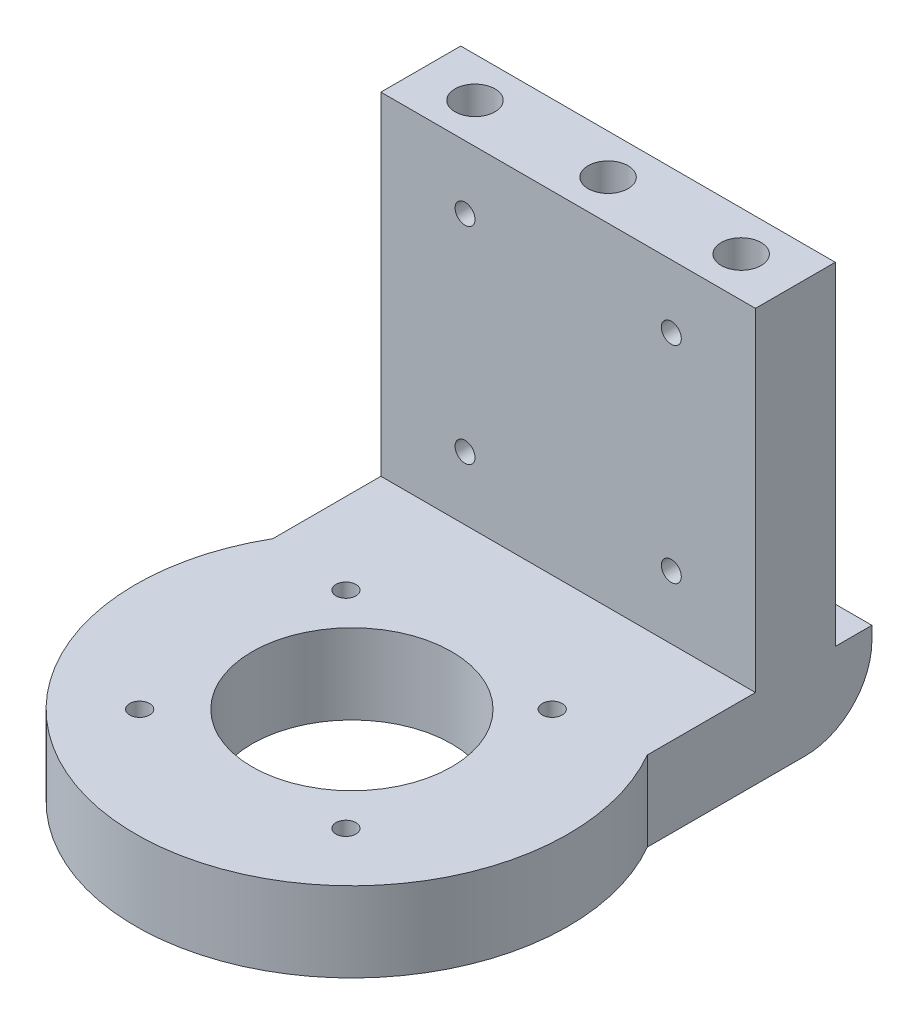
ISO-10303-21;
HEADER;
FILE_DESCRIPTION(('STEP AP214'),'2;1');
FILE_NAME('part.step','',(''),(''),'','','');
FILE_SCHEMA(('AUTOMOTIVE_DESIGN { 1 0 10303 214 1 1 1 1 }'));
ENDSEC;
DATA;
#1=APPLICATION_CONTEXT('core data for automotive mechanical design processes');
#2=APPLICATION_PROTOCOL_DEFINITION('international standard','automotive_design',2000,#1);
#3=PRODUCT_CONTEXT('',#1,'mechanical');
#4=PRODUCT('Part','Part','',(#3));
#5=PRODUCT_RELATED_PRODUCT_CATEGORY('part','',(#4));
#6=PRODUCT_DEFINITION_FORMATION('','',#4);
#7=PRODUCT_DEFINITION_CONTEXT('part definition',#1,'design');
#8=PRODUCT_DEFINITION('design','',#6,#7);
#9=PRODUCT_DEFINITION_SHAPE('','',#8);
#10=(LENGTH_UNIT() NAMED_UNIT(*) SI_UNIT(.MILLI.,.METRE.));
#11=(NAMED_UNIT(*) PLANE_ANGLE_UNIT() SI_UNIT($,.RADIAN.));
#12=(NAMED_UNIT(*) SI_UNIT($,.STERADIAN.) SOLID_ANGLE_UNIT());
#13=UNCERTAINTY_MEASURE_WITH_UNIT(LENGTH_MEASURE(1.E-05),#10,'distance_accuracy_value','');
#14=(GEOMETRIC_REPRESENTATION_CONTEXT(3) GLOBAL_UNCERTAINTY_ASSIGNED_CONTEXT((#13)) GLOBAL_UNIT_ASSIGNED_CONTEXT((#10,
#11,#12)) REPRESENTATION_CONTEXT('',''));
#15=CARTESIAN_POINT('',(0.,0.,0.));
#16=DIRECTION('',(0.,0.,1.));
#17=DIRECTION('',(1.,0.,0.));
#18=AXIS2_PLACEMENT_3D('',#15,#16,#17);
#19=CARTESIAN_POINT('',(-15.95,0.,-15.05));
#20=DIRECTION('',(0.,1.,0.));
#21=DIRECTION('',(0.,0.,1.));
#22=AXIS2_PLACEMENT_3D('',#19,#20,#21);
#23=CYLINDRICAL_SURFACE('',#22,1.5);
#24=CARTESIAN_POINT('',(-15.95,12.,-15.05));
#25=DIRECTION('',(0.,1.,0.));
#26=DIRECTION('',(0.,0.,1.));
#27=AXIS2_PLACEMENT_3D('',#24,#25,#26);
#28=CIRCLE('',#27,1.5);
#29=CARTESIAN_POINT('',(-15.95,12.,-13.55));
#30=VERTEX_POINT('',#29);
#31=EDGE_CURVE('E182',#30,#30,#28,.T.);
#32=ORIENTED_EDGE('',*,*,#31,.T.);
#33=EDGE_LOOP('',(#32));
#34=FACE_BOUND('',#33,.T.);
#35=CARTESIAN_POINT('',(-15.95,3.,-15.05));
#36=DIRECTION('',(0.,-1.,0.));
#37=DIRECTION('',(0.,0.,-1.));
#38=AXIS2_PLACEMENT_3D('',#35,#36,#37);
#39=CIRCLE('',#38,1.5);
#40=CARTESIAN_POINT('',(-15.95,3.,-16.55));
#41=VERTEX_POINT('',#40);
#42=EDGE_CURVE('E223',#41,#41,#39,.F.);
#43=ORIENTED_EDGE('',*,*,#42,.F.);
#44=EDGE_LOOP('',(#43));
#45=FACE_BOUND('',#44,.T.);
#46=ADVANCED_FACE('F42',(#34,#45),#23,.F.);
#47=CARTESIAN_POINT('',(15.05,0.,-15.05));
#48=DIRECTION('',(0.,1.,0.));
#49=DIRECTION('',(0.,0.,1.));
#50=AXIS2_PLACEMENT_3D('',#47,#48,#49);
#51=CYLINDRICAL_SURFACE('',#50,1.5);
#52=CARTESIAN_POINT('',(15.05,12.,-15.05));
#53=DIRECTION('',(0.,1.,0.));
#54=DIRECTION('',(0.,0.,1.));
#55=AXIS2_PLACEMENT_3D('',#52,#53,#54);
#56=CIRCLE('',#55,1.5);
#57=CARTESIAN_POINT('',(15.05,12.,-13.55));
#58=VERTEX_POINT('',#57);
#59=EDGE_CURVE('E178',#58,#58,#56,.T.);
#60=ORIENTED_EDGE('',*,*,#59,.T.);
#61=EDGE_LOOP('',(#60));
#62=FACE_BOUND('',#61,.T.);
#63=CARTESIAN_POINT('',(15.05,3.,-15.05));
#64=DIRECTION('',(0.,-1.,0.));
#65=DIRECTION('',(0.,0.,-1.));
#66=AXIS2_PLACEMENT_3D('',#63,#64,#65);
#67=CIRCLE('',#66,1.5);
#68=CARTESIAN_POINT('',(15.05,3.,-16.55));
#69=VERTEX_POINT('',#68);
#70=EDGE_CURVE('E219',#69,#69,#67,.F.);
#71=ORIENTED_EDGE('',*,*,#70,.F.);
#72=EDGE_LOOP('',(#71));
#73=FACE_BOUND('',#72,.T.);
#74=ADVANCED_FACE('F287',(#62,#73),#51,.F.);
#75=CARTESIAN_POINT('',(15.05,0.,15.95));
#76=DIRECTION('',(0.,1.,0.));
#77=DIRECTION('',(0.,0.,1.));
#78=AXIS2_PLACEMENT_3D('',#75,#76,#77);
#79=CYLINDRICAL_SURFACE('',#78,1.5);
#80=CARTESIAN_POINT('',(15.05,12.,15.95));
#81=DIRECTION('',(0.,1.,0.));
#82=DIRECTION('',(0.,0.,1.));
#83=AXIS2_PLACEMENT_3D('',#80,#81,#82);
#84=CIRCLE('',#83,1.5);
#85=CARTESIAN_POINT('',(15.05,12.,17.45));
#86=VERTEX_POINT('',#85);
#87=EDGE_CURVE('E183',#86,#86,#84,.T.);
#88=ORIENTED_EDGE('',*,*,#87,.T.);
#89=EDGE_LOOP('',(#88));
#90=FACE_BOUND('',#89,.T.);
#91=CARTESIAN_POINT('',(15.05,3.,15.95));
#92=DIRECTION('',(0.,-1.,0.));
#93=DIRECTION('',(0.,0.,-1.));
#94=AXIS2_PLACEMENT_3D('',#91,#92,#93);
#95=CIRCLE('',#94,1.5);
#96=CARTESIAN_POINT('',(15.05,3.,14.45));
#97=VERTEX_POINT('',#96);
#98=EDGE_CURVE('E214',#97,#97,#95,.F.);
#99=ORIENTED_EDGE('',*,*,#98,.F.);
#100=EDGE_LOOP('',(#99));
#101=FACE_BOUND('',#100,.T.);
#102=ADVANCED_FACE('F293',(#90,#101),#79,.F.);
#103=CARTESIAN_POINT('',(-15.95,0.,15.95));
#104=DIRECTION('',(0.,1.,0.));
#105=DIRECTION('',(0.,0.,1.));
#106=AXIS2_PLACEMENT_3D('',#103,#104,#105);
#107=CYLINDRICAL_SURFACE('',#106,1.5);
#108=CARTESIAN_POINT('',(-15.95,12.,15.95));
#109=DIRECTION('',(0.,1.,0.));
#110=DIRECTION('',(0.,0.,1.));
#111=AXIS2_PLACEMENT_3D('',#108,#109,#110);
#112=CIRCLE('',#111,1.5);
#113=CARTESIAN_POINT('',(-15.95,12.,17.45));
#114=VERTEX_POINT('',#113);
#115=EDGE_CURVE('E168',#114,#114,#112,.T.);
#116=ORIENTED_EDGE('',*,*,#115,.T.);
#117=EDGE_LOOP('',(#116));
#118=FACE_BOUND('',#117,.T.);
#119=CARTESIAN_POINT('',(-15.95,3.,15.95));
#120=DIRECTION('',(0.,-1.,0.));
#121=DIRECTION('',(0.,0.,-1.));
#122=AXIS2_PLACEMENT_3D('',#119,#120,#121);
#123=CIRCLE('',#122,1.5);
#124=CARTESIAN_POINT('',(-15.95,3.,14.45));
#125=VERTEX_POINT('',#124);
#126=EDGE_CURVE('E210',#125,#125,#123,.F.);
#127=ORIENTED_EDGE('',*,*,#126,.F.);
#128=EDGE_LOOP('',(#127));
#129=FACE_BOUND('',#128,.T.);
#130=ADVANCED_FACE('F299',(#118,#129),#107,.F.);
#131=CARTESIAN_POINT('',(0.,12.,0.));
#132=DIRECTION('',(0.,1.,0.));
#133=DIRECTION('',(0.,0.,1.));
#134=AXIS2_PLACEMENT_3D('',#131,#132,#133);
#135=PLANE('',#134);
#136=DIRECTION('',(-1.,0.,0.));
#137=VECTOR('',#136,1.);
#138=CARTESIAN_POINT('',(28.1458256229942,12.,-44.5));
#139=LINE('',#138,#137);
#140=CARTESIAN_POINT('',(28.1458256229942,12.,-44.5));
#141=VERTEX_POINT('',#140);
#142=CARTESIAN_POINT('',(-28.1458256229944,12.,-44.5));
#143=VERTEX_POINT('',#142);
#144=EDGE_CURVE('E133',#141,#143,#139,.T.);
#145=ORIENTED_EDGE('',*,*,#144,.F.);
#146=DIRECTION('',(0.,0.,1.));
#147=VECTOR('',#146,1.);
#148=CARTESIAN_POINT('',(28.1458256229942,12.,0.));
#149=LINE('',#148,#147);
#150=CARTESIAN_POINT('',(28.1458256229942,12.,-50.));
#151=VERTEX_POINT('',#150);
#152=EDGE_CURVE('E154',#151,#141,#149,.T.);
#153=ORIENTED_EDGE('',*,*,#152,.F.);
#154=DIRECTION('',(-1.,0.,0.));
#155=VECTOR('',#154,1.);
#156=CARTESIAN_POINT('',(0.,12.,-50.));
#157=LINE('',#156,#155);
#158=CARTESIAN_POINT('',(-28.1458256229944,12.,-50.));
#159=VERTEX_POINT('',#158);
#160=EDGE_CURVE('E140',#151,#159,#157,.T.);
#161=ORIENTED_EDGE('',*,*,#160,.T.);
#162=DIRECTION('',(0.,0.,1.));
#163=VECTOR('',#162,1.);
#164=CARTESIAN_POINT('',(-28.1458256229944,12.,0.));
#165=LINE('',#164,#163);
#166=EDGE_CURVE('E158',#159,#143,#165,.T.);
#167=ORIENTED_EDGE('',*,*,#166,.T.);
#168=EDGE_LOOP('',(#145,#153,#161,#167));
#169=FACE_BOUND('',#168,.T.);
#170=ADVANCED_FACE('F272',(#169),#135,.T.);
#171=CARTESIAN_POINT('',(0.,12.,0.));
#172=DIRECTION('',(0.,-1.,0.));
#173=DIRECTION('',(0.,0.,-1.));
#174=AXIS2_PLACEMENT_3D('',#171,#172,#173);
#175=CYLINDRICAL_SURFACE('',#174,32.5);
#176=DIRECTION('',(0.,1.,0.));
#177=VECTOR('',#176,1.);
#178=CARTESIAN_POINT('',(28.1458256229942,0.,-16.2500000000001));
#179=LINE('',#178,#177);
#180=CARTESIAN_POINT('',(28.1458256229942,0.,-16.2500000000001));
#181=VERTEX_POINT('',#180);
#182=CARTESIAN_POINT('',(28.1458256229942,12.,-16.2500000000001));
#183=VERTEX_POINT('',#182);
#184=EDGE_CURVE('E169',#181,#183,#179,.T.);
#185=ORIENTED_EDGE('',*,*,#184,.T.);
#186=CARTESIAN_POINT('',(0.,12.,0.));
#187=DIRECTION('',(0.,1.,0.));
#188=DIRECTION('',(0.,0.,1.));
#189=AXIS2_PLACEMENT_3D('',#186,#187,#188);
#190=CIRCLE('',#189,32.5);
#191=CARTESIAN_POINT('',(-28.1458256229944,12.,-16.2499999999998));
#192=VERTEX_POINT('',#191);
#193=EDGE_CURVE('E202',#192,#183,#190,.T.);
#194=ORIENTED_EDGE('',*,*,#193,.F.);
#195=DIRECTION('',(0.,1.,0.));
#196=VECTOR('',#195,1.);
#197=CARTESIAN_POINT('',(-28.1458256229944,0.,-16.2499999999998));
#198=LINE('',#197,#196);
#199=CARTESIAN_POINT('',(-28.1458256229944,0.,-16.2499999999998));
#200=VERTEX_POINT('',#199);
#201=EDGE_CURVE('E173',#200,#192,#198,.T.);
#202=ORIENTED_EDGE('',*,*,#201,.F.);
#203=CARTESIAN_POINT('',(0.,0.,0.));
#204=DIRECTION('',(0.,1.,0.));
#205=DIRECTION('',(0.,0.,1.));
#206=AXIS2_PLACEMENT_3D('',#203,#204,#205);
#207=CIRCLE('',#206,32.5);
#208=EDGE_CURVE('E198',#200,#181,#207,.T.);
#209=ORIENTED_EDGE('',*,*,#208,.T.);
#210=EDGE_LOOP('',(#185,#194,#202,#209));
#211=FACE_BOUND('',#210,.T.);
#212=ADVANCED_FACE('F243',(#211),#175,.T.);
#213=DIRECTION('',(1.,0.,0.));
#214=VECTOR('',#213,1.);
#215=CARTESIAN_POINT('',(0.,12.,-32.5));
#216=LINE('',#215,#214);
#217=CARTESIAN_POINT('',(-28.1458256229944,12.,-32.5));
#218=VERTEX_POINT('',#217);
#219=CARTESIAN_POINT('',(28.1458256229942,12.,-32.5));
#220=VERTEX_POINT('',#219);
#221=EDGE_CURVE('E239',#218,#220,#216,.T.);
#222=ORIENTED_EDGE('',*,*,#221,.F.);
#223=EDGE_CURVE('E138',#218,#192,#165,.T.);
#224=ORIENTED_EDGE('',*,*,#223,.T.);
#225=ORIENTED_EDGE('',*,*,#193,.T.);
#226=EDGE_CURVE('E161',#220,#183,#149,.T.);
#227=ORIENTED_EDGE('',*,*,#226,.F.);
#228=EDGE_LOOP('',(#222,#224,#225,#227));
#229=FACE_BOUND('',#228,.T.);
#230=ORIENTED_EDGE('',*,*,#115,.F.);
#231=EDGE_LOOP('',(#230));
#232=FACE_BOUND('',#231,.T.);
#233=ORIENTED_EDGE('',*,*,#87,.F.);
#234=EDGE_LOOP('',(#233));
#235=FACE_BOUND('',#234,.T.);
#236=ORIENTED_EDGE('',*,*,#59,.F.);
#237=EDGE_LOOP('',(#236));
#238=FACE_BOUND('',#237,.T.);
#239=ORIENTED_EDGE('',*,*,#31,.F.);
#240=EDGE_LOOP('',(#239));
#241=FACE_BOUND('',#240,.T.);
#242=CARTESIAN_POINT('',(0.,12.,0.));
#243=DIRECTION('',(0.,1.,0.));
#244=DIRECTION('',(0.,0.,1.));
#245=AXIS2_PLACEMENT_3D('',#242,#243,#244);
#246=CIRCLE('',#245,15.);
#247=CARTESIAN_POINT('',(0.,12.,15.));
#248=VERTEX_POINT('',#247);
#249=EDGE_CURVE('E194',#248,#248,#246,.T.);
#250=ORIENTED_EDGE('',*,*,#249,.F.);
#251=EDGE_LOOP('',(#250));
#252=FACE_BOUND('',#251,.T.);
#253=ADVANCED_FACE('F236',(#229,#232,#235,#238,#241,#252),#135,.T.);
#254=CARTESIAN_POINT('',(0.,0.,0.));
#255=DIRECTION('',(0.,1.,0.));
#256=DIRECTION('',(0.,0.,1.));
#257=AXIS2_PLACEMENT_3D('',#254,#255,#256);
#258=PLANE('',#257);
#259=CARTESIAN_POINT('',(15.05,0.,15.95));
#260=DIRECTION('',(0.,-1.,0.));
#261=DIRECTION('',(0.,0.,-1.));
#262=AXIS2_PLACEMENT_3D('',#259,#260,#261);
#263=CIRCLE('',#262,3.);
#264=CARTESIAN_POINT('',(15.05,0.,12.95));
#265=VERTEX_POINT('',#264);
#266=EDGE_CURVE('E668',#265,#265,#263,.T.);
#267=ORIENTED_EDGE('',*,*,#266,.F.);
#268=EDGE_LOOP('',(#267));
#269=FACE_BOUND('',#268,.T.);
#270=CARTESIAN_POINT('',(-15.95,0.,-15.05));
#271=DIRECTION('',(0.,-1.,0.));
#272=DIRECTION('',(0.,0.,-1.));
#273=AXIS2_PLACEMENT_3D('',#270,#271,#272);
#274=CIRCLE('',#273,3.);
#275=CARTESIAN_POINT('',(-15.95,0.,-18.05));
#276=VERTEX_POINT('',#275);
#277=EDGE_CURVE('E659',#276,#276,#274,.T.);
#278=ORIENTED_EDGE('',*,*,#277,.F.);
#279=EDGE_LOOP('',(#278));
#280=FACE_BOUND('',#279,.T.);
#281=CARTESIAN_POINT('',(15.05,0.,-15.05));
#282=DIRECTION('',(0.,-1.,0.));
#283=DIRECTION('',(0.,0.,-1.));
#284=AXIS2_PLACEMENT_3D('',#281,#282,#283);
#285=CIRCLE('',#284,3.);
#286=CARTESIAN_POINT('',(15.05,0.,-18.05));
#287=VERTEX_POINT('',#286);
#288=EDGE_CURVE('E648',#287,#287,#285,.T.);
#289=ORIENTED_EDGE('',*,*,#288,.F.);
#290=EDGE_LOOP('',(#289));
#291=FACE_BOUND('',#290,.T.);
#292=CARTESIAN_POINT('',(-15.95,0.,15.95));
#293=DIRECTION('',(0.,-1.,0.));
#294=DIRECTION('',(0.,0.,-1.));
#295=AXIS2_PLACEMENT_3D('',#292,#293,#294);
#296=CIRCLE('',#295,3.);
#297=CARTESIAN_POINT('',(-15.95,0.,12.95));
#298=VERTEX_POINT('',#297);
#299=EDGE_CURVE('E667',#298,#298,#296,.T.);
#300=ORIENTED_EDGE('',*,*,#299,.F.);
#301=EDGE_LOOP('',(#300));
#302=FACE_BOUND('',#301,.T.);
#303=DIRECTION('',(0.,0.,1.));
#304=VECTOR('',#303,1.);
#305=CARTESIAN_POINT('',(-28.1458256229944,0.,0.));
#306=LINE('',#305,#304);
#307=CARTESIAN_POINT('',(-28.1458256229944,0.,-40.));
#308=VERTEX_POINT('',#307);
#309=EDGE_CURVE('E150',#308,#200,#306,.T.);
#310=ORIENTED_EDGE('',*,*,#309,.F.);
#311=DIRECTION('',(-1.,0.,0.));
#312=VECTOR('',#311,1.);
#313=CARTESIAN_POINT('',(28.1458256229942,0.,-40.));
#314=LINE('',#313,#312);
#315=CARTESIAN_POINT('',(28.1458256229942,0.,-40.));
#316=VERTEX_POINT('',#315);
#317=EDGE_CURVE('E51',#308,#316,#314,.F.);
#318=ORIENTED_EDGE('',*,*,#317,.T.);
#319=DIRECTION('',(0.,0.,1.));
#320=VECTOR('',#319,1.);
#321=CARTESIAN_POINT('',(28.1458256229942,0.,0.));
#322=LINE('',#321,#320);
#323=EDGE_CURVE('E153',#316,#181,#322,.T.);
#324=ORIENTED_EDGE('',*,*,#323,.T.);
#325=ORIENTED_EDGE('',*,*,#208,.F.);
#326=EDGE_LOOP('',(#310,#318,#324,#325));
#327=FACE_BOUND('',#326,.T.);
#328=CARTESIAN_POINT('',(0.,0.,0.));
#329=DIRECTION('',(0.,1.,0.));
#330=DIRECTION('',(0.,0.,1.));
#331=AXIS2_PLACEMENT_3D('',#328,#329,#330);
#332=CIRCLE('',#331,15.);
#333=CARTESIAN_POINT('',(0.,0.,15.));
#334=VERTEX_POINT('',#333);
#335=EDGE_CURVE('E193',#334,#334,#332,.T.);
#336=ORIENTED_EDGE('',*,*,#335,.T.);
#337=EDGE_LOOP('',(#336));
#338=FACE_BOUND('',#337,.T.);
#339=ADVANCED_FACE('F304',(#269,#280,#291,#302,#327,#338),#258,.F.);
#340=CARTESIAN_POINT('',(0.,12.,0.));
#341=DIRECTION('',(0.,-1.,0.));
#342=DIRECTION('',(0.,0.,-1.));
#343=AXIS2_PLACEMENT_3D('',#340,#341,#342);
#344=CYLINDRICAL_SURFACE('',#343,15.);
#345=ORIENTED_EDGE('',*,*,#249,.T.);
#346=EDGE_LOOP('',(#345));
#347=FACE_BOUND('',#346,.T.);
#348=ORIENTED_EDGE('',*,*,#335,.F.);
#349=EDGE_LOOP('',(#348));
#350=FACE_BOUND('',#349,.T.);
#351=ADVANCED_FACE('F301',(#347,#350),#344,.F.);
#352=CARTESIAN_POINT('',(0.,0.,-50.));
#353=DIRECTION('',(0.,0.,-1.));
#354=DIRECTION('',(-1.,0.,0.));
#355=AXIS2_PLACEMENT_3D('',#352,#353,#354);
#356=PLANE('',#355);
#357=DIRECTION('',(0.,1.,0.));
#358=VECTOR('',#357,1.);
#359=CARTESIAN_POINT('',(28.1458256229942,0.,-50.));
#360=LINE('',#359,#358);
#361=CARTESIAN_POINT('',(28.1458256229942,10.,-50.));
#362=VERTEX_POINT('',#361);
#363=EDGE_CURVE('E165',#362,#151,#360,.T.);
#364=ORIENTED_EDGE('',*,*,#363,.F.);
#365=DIRECTION('',(-1.,0.,0.));
#366=VECTOR('',#365,1.);
#367=CARTESIAN_POINT('',(-28.1458256229944,10.,-50.));
#368=LINE('',#367,#366);
#369=CARTESIAN_POINT('',(-28.1458256229944,10.,-50.));
#370=VERTEX_POINT('',#369);
#371=EDGE_CURVE('E206',#362,#370,#368,.T.);
#372=ORIENTED_EDGE('',*,*,#371,.T.);
#373=DIRECTION('',(0.,1.,0.));
#374=VECTOR('',#373,1.);
#375=CARTESIAN_POINT('',(-28.1458256229944,0.,-50.));
#376=LINE('',#375,#374);
#377=EDGE_CURVE('E156',#370,#159,#376,.T.);
#378=ORIENTED_EDGE('',*,*,#377,.T.);
#379=ORIENTED_EDGE('',*,*,#160,.F.);
#380=EDGE_LOOP('',(#364,#372,#378,#379));
#381=FACE_BOUND('',#380,.T.);
#382=ADVANCED_FACE('F274',(#381),#356,.T.);
#383=CARTESIAN_POINT('',(28.1458256229942,0.,0.));
#384=DIRECTION('',(-1.,0.,0.));
#385=DIRECTION('',(0.,0.,1.));
#386=AXIS2_PLACEMENT_3D('',#383,#384,#385);
#387=PLANE('',#386);
#388=ORIENTED_EDGE('',*,*,#323,.F.);
#389=CARTESIAN_POINT('',(28.1458256229942,10.,-40.));
#390=DIRECTION('',(-1.,0.,0.));
#391=DIRECTION('',(0.,0.,1.));
#392=AXIS2_PLACEMENT_3D('',#389,#390,#391);
#393=CIRCLE('',#392,10.);
#394=EDGE_CURVE('E11',#316,#362,#393,.F.);
#395=ORIENTED_EDGE('',*,*,#394,.T.);
#396=ORIENTED_EDGE('',*,*,#363,.T.);
#397=ORIENTED_EDGE('',*,*,#152,.T.);
#398=DIRECTION('',(0.,-1.,0.));
#399=VECTOR('',#398,1.);
#400=CARTESIAN_POINT('',(28.1458256229942,62.,-44.5));
#401=LINE('',#400,#399);
#402=CARTESIAN_POINT('',(28.1458256229942,62.,-44.5));
#403=VERTEX_POINT('',#402);
#404=EDGE_CURVE('E146',#403,#141,#401,.T.);
#405=ORIENTED_EDGE('',*,*,#404,.F.);
#406=DIRECTION('',(0.,0.,-1.));
#407=VECTOR('',#406,1.);
#408=CARTESIAN_POINT('',(28.1458256229942,62.,-32.5));
#409=LINE('',#408,#407);
#410=CARTESIAN_POINT('',(28.1458256229942,62.,-32.5));
#411=VERTEX_POINT('',#410);
#412=EDGE_CURVE('E123',#411,#403,#409,.T.);
#413=ORIENTED_EDGE('',*,*,#412,.F.);
#414=DIRECTION('',(0.,-1.,0.));
#415=VECTOR('',#414,1.);
#416=CARTESIAN_POINT('',(28.1458256229942,62.,-32.5));
#417=LINE('',#416,#415);
#418=EDGE_CURVE('E119',#411,#220,#417,.T.);
#419=ORIENTED_EDGE('',*,*,#418,.T.);
#420=ORIENTED_EDGE('',*,*,#226,.T.);
#421=ORIENTED_EDGE('',*,*,#184,.F.);
#422=EDGE_LOOP('',(#388,#395,#396,#397,#405,#413,#419,#420,#421));
#423=FACE_BOUND('',#422,.T.);
#424=ADVANCED_FACE('F246',(#423),#387,.F.);
#425=CARTESIAN_POINT('',(-28.1458256229944,0.,0.));
#426=DIRECTION('',(-1.,0.,0.));
#427=DIRECTION('',(0.,0.,1.));
#428=AXIS2_PLACEMENT_3D('',#425,#426,#427);
#429=PLANE('',#428);
#430=ORIENTED_EDGE('',*,*,#377,.F.);
#431=CARTESIAN_POINT('',(-28.1458256229944,10.,-40.));
#432=DIRECTION('',(-1.,0.,0.));
#433=DIRECTION('',(0.,0.,1.));
#434=AXIS2_PLACEMENT_3D('',#431,#432,#433);
#435=CIRCLE('',#434,10.);
#436=EDGE_CURVE('E65',#370,#308,#435,.T.);
#437=ORIENTED_EDGE('',*,*,#436,.T.);
#438=ORIENTED_EDGE('',*,*,#309,.T.);
#439=ORIENTED_EDGE('',*,*,#201,.T.);
#440=ORIENTED_EDGE('',*,*,#223,.F.);
#441=DIRECTION('',(0.,-1.,0.));
#442=VECTOR('',#441,1.);
#443=CARTESIAN_POINT('',(-28.1458256229944,62.,-32.5));
#444=LINE('',#443,#442);
#445=CARTESIAN_POINT('',(-28.1458256229944,62.,-32.5));
#446=VERTEX_POINT('',#445);
#447=EDGE_CURVE('E117',#446,#218,#444,.T.);
#448=ORIENTED_EDGE('',*,*,#447,.F.);
#449=DIRECTION('',(0.,0.,1.));
#450=VECTOR('',#449,1.);
#451=CARTESIAN_POINT('',(-28.1458256229944,62.,-44.5));
#452=LINE('',#451,#450);
#453=CARTESIAN_POINT('',(-28.1458256229944,62.,-44.5));
#454=VERTEX_POINT('',#453);
#455=EDGE_CURVE('E124',#454,#446,#452,.T.);
#456=ORIENTED_EDGE('',*,*,#455,.F.);
#457=DIRECTION('',(0.,-1.,0.));
#458=VECTOR('',#457,1.);
#459=CARTESIAN_POINT('',(-28.1458256229944,62.,-44.5));
#460=LINE('',#459,#458);
#461=EDGE_CURVE('E261',#454,#143,#460,.T.);
#462=ORIENTED_EDGE('',*,*,#461,.T.);
#463=ORIENTED_EDGE('',*,*,#166,.F.);
#464=EDGE_LOOP('',(#430,#437,#438,#439,#440,#448,#456,#462,#463));
#465=FACE_BOUND('',#464,.T.);
#466=ADVANCED_FACE('F136',(#465),#429,.T.);
#467=CARTESIAN_POINT('',(0.,62.,-32.5));
#468=DIRECTION('',(0.,0.,-1.));
#469=DIRECTION('',(-1.,0.,0.));
#470=AXIS2_PLACEMENT_3D('',#467,#468,#469);
#471=PLANE('',#470);
#472=CARTESIAN_POINT('',(-15.5,52.5,-32.5));
#473=DIRECTION('',(0.,0.,-1.));
#474=DIRECTION('',(-1.,0.,0.));
#475=AXIS2_PLACEMENT_3D('',#472,#473,#474);
#476=CIRCLE('',#475,1.5);
#477=CARTESIAN_POINT('',(-17.,52.5,-32.5));
#478=VERTEX_POINT('',#477);
#479=EDGE_CURVE('E642',#478,#478,#476,.T.);
#480=ORIENTED_EDGE('',*,*,#479,.T.);
#481=EDGE_LOOP('',(#480));
#482=FACE_BOUND('',#481,.T.);
#483=CARTESIAN_POINT('',(-15.5,21.5,-32.5));
#484=DIRECTION('',(0.,0.,-1.));
#485=DIRECTION('',(-1.,0.,0.));
#486=AXIS2_PLACEMENT_3D('',#483,#484,#485);
#487=CIRCLE('',#486,1.5);
#488=CARTESIAN_POINT('',(-17.,21.5,-32.5));
#489=VERTEX_POINT('',#488);
#490=EDGE_CURVE('E639',#489,#489,#487,.T.);
#491=ORIENTED_EDGE('',*,*,#490,.T.);
#492=EDGE_LOOP('',(#491));
#493=FACE_BOUND('',#492,.T.);
#494=CARTESIAN_POINT('',(15.5,21.5,-32.5));
#495=DIRECTION('',(0.,0.,-1.));
#496=DIRECTION('',(-1.,0.,0.));
#497=AXIS2_PLACEMENT_3D('',#494,#495,#496);
#498=CIRCLE('',#497,1.5);
#499=CARTESIAN_POINT('',(14.,21.5,-32.5));
#500=VERTEX_POINT('',#499);
#501=EDGE_CURVE('E643',#500,#500,#498,.T.);
#502=ORIENTED_EDGE('',*,*,#501,.T.);
#503=EDGE_LOOP('',(#502));
#504=FACE_BOUND('',#503,.T.);
#505=CARTESIAN_POINT('',(15.5,52.5,-32.5));
#506=DIRECTION('',(0.,0.,-1.));
#507=DIRECTION('',(-1.,0.,0.));
#508=AXIS2_PLACEMENT_3D('',#505,#506,#507);
#509=CIRCLE('',#508,1.5);
#510=CARTESIAN_POINT('',(14.,52.5,-32.5));
#511=VERTEX_POINT('',#510);
#512=EDGE_CURVE('E651',#511,#511,#509,.T.);
#513=ORIENTED_EDGE('',*,*,#512,.T.);
#514=EDGE_LOOP('',(#513));
#515=FACE_BOUND('',#514,.T.);
#516=ORIENTED_EDGE('',*,*,#221,.T.);
#517=ORIENTED_EDGE('',*,*,#418,.F.);
#518=DIRECTION('',(1.,0.,0.));
#519=VECTOR('',#518,1.);
#520=CARTESIAN_POINT('',(-28.1458256229944,62.,-32.5));
#521=LINE('',#520,#519);
#522=EDGE_CURVE('E112',#446,#411,#521,.T.);
#523=ORIENTED_EDGE('',*,*,#522,.F.);
#524=ORIENTED_EDGE('',*,*,#447,.T.);
#525=EDGE_LOOP('',(#516,#517,#523,#524));
#526=FACE_BOUND('',#525,.T.);
#527=ADVANCED_FACE('F115',(#482,#493,#504,#515,#526),#471,.F.);
#528=CARTESIAN_POINT('',(28.1458256229942,62.,-44.5));
#529=DIRECTION('',(0.,0.,1.));
#530=DIRECTION('',(1.,0.,0.));
#531=AXIS2_PLACEMENT_3D('',#528,#529,#530);
#532=PLANE('',#531);
#533=CARTESIAN_POINT('',(-15.5,52.5,-44.5));
#534=DIRECTION('',(0.,0.,-1.));
#535=DIRECTION('',(-1.,0.,0.));
#536=AXIS2_PLACEMENT_3D('',#533,#534,#535);
#537=CIRCLE('',#536,1.5);
#538=CARTESIAN_POINT('',(-17.,52.5,-44.5));
#539=VERTEX_POINT('',#538);
#540=EDGE_CURVE('E747',#539,#539,#537,.T.);
#541=ORIENTED_EDGE('',*,*,#540,.F.);
#542=EDGE_LOOP('',(#541));
#543=FACE_BOUND('',#542,.T.);
#544=CARTESIAN_POINT('',(-15.5,21.5,-44.5));
#545=DIRECTION('',(0.,0.,-1.));
#546=DIRECTION('',(-1.,0.,0.));
#547=AXIS2_PLACEMENT_3D('',#544,#545,#546);
#548=CIRCLE('',#547,1.5);
#549=CARTESIAN_POINT('',(-17.,21.5,-44.5));
#550=VERTEX_POINT('',#549);
#551=EDGE_CURVE('E636',#550,#550,#548,.T.);
#552=ORIENTED_EDGE('',*,*,#551,.F.);
#553=EDGE_LOOP('',(#552));
#554=FACE_BOUND('',#553,.T.);
#555=CARTESIAN_POINT('',(15.5,21.5,-44.5));
#556=DIRECTION('',(0.,0.,-1.));
#557=DIRECTION('',(-1.,0.,0.));
#558=AXIS2_PLACEMENT_3D('',#555,#556,#557);
#559=CIRCLE('',#558,1.5);
#560=CARTESIAN_POINT('',(14.,21.5,-44.5));
#561=VERTEX_POINT('',#560);
#562=EDGE_CURVE('E746',#561,#561,#559,.T.);
#563=ORIENTED_EDGE('',*,*,#562,.F.);
#564=EDGE_LOOP('',(#563));
#565=FACE_BOUND('',#564,.T.);
#566=CARTESIAN_POINT('',(15.5,52.5,-44.5));
#567=DIRECTION('',(0.,0.,-1.));
#568=DIRECTION('',(-1.,0.,0.));
#569=AXIS2_PLACEMENT_3D('',#566,#567,#568);
#570=CIRCLE('',#569,1.5);
#571=CARTESIAN_POINT('',(14.,52.5,-44.5));
#572=VERTEX_POINT('',#571);
#573=EDGE_CURVE('E742',#572,#572,#570,.T.);
#574=ORIENTED_EDGE('',*,*,#573,.F.);
#575=EDGE_LOOP('',(#574));
#576=FACE_BOUND('',#575,.T.);
#577=ORIENTED_EDGE('',*,*,#144,.T.);
#578=ORIENTED_EDGE('',*,*,#461,.F.);
#579=DIRECTION('',(-1.,0.,0.));
#580=VECTOR('',#579,1.);
#581=CARTESIAN_POINT('',(28.1458256229942,62.,-44.5));
#582=LINE('',#581,#580);
#583=EDGE_CURVE('E129',#403,#454,#582,.T.);
#584=ORIENTED_EDGE('',*,*,#583,.F.);
#585=ORIENTED_EDGE('',*,*,#404,.T.);
#586=EDGE_LOOP('',(#577,#578,#584,#585));
#587=FACE_BOUND('',#586,.T.);
#588=ADVANCED_FACE('F267',(#543,#554,#565,#576,#587),#532,.F.);
#589=CARTESIAN_POINT('',(0.,62.,0.));
#590=DIRECTION('',(0.,1.,0.));
#591=DIRECTION('',(0.,0.,1.));
#592=AXIS2_PLACEMENT_3D('',#589,#590,#591);
#593=PLANE('',#592);
#594=CARTESIAN_POINT('',(-20.,62.,-38.5));
#595=DIRECTION('',(0.,1.,0.));
#596=DIRECTION('',(0.,0.,1.));
#597=AXIS2_PLACEMENT_3D('',#594,#595,#596);
#598=CIRCLE('',#597,3.);
#599=CARTESIAN_POINT('',(-20.,62.,-35.5));
#600=VERTEX_POINT('',#599);
#601=EDGE_CURVE('E227',#600,#600,#598,.T.);
#602=ORIENTED_EDGE('',*,*,#601,.F.);
#603=EDGE_LOOP('',(#602));
#604=FACE_BOUND('',#603,.T.);
#605=CARTESIAN_POINT('',(20.,62.,-38.5));
#606=DIRECTION('',(0.,1.,0.));
#607=DIRECTION('',(0.,0.,1.));
#608=AXIS2_PLACEMENT_3D('',#605,#606,#607);
#609=CIRCLE('',#608,3.);
#610=CARTESIAN_POINT('',(20.,62.,-35.5));
#611=VERTEX_POINT('',#610);
#612=EDGE_CURVE('E688',#611,#611,#609,.T.);
#613=ORIENTED_EDGE('',*,*,#612,.F.);
#614=EDGE_LOOP('',(#613));
#615=FACE_BOUND('',#614,.T.);
#616=CARTESIAN_POINT('',(0.,62.,-38.5));
#617=DIRECTION('',(0.,1.,0.));
#618=DIRECTION('',(0.,0.,1.));
#619=AXIS2_PLACEMENT_3D('',#616,#617,#618);
#620=CIRCLE('',#619,3.);
#621=CARTESIAN_POINT('',(0.,62.,-35.5));
#622=VERTEX_POINT('',#621);
#623=EDGE_CURVE('E256',#622,#622,#620,.T.);
#624=ORIENTED_EDGE('',*,*,#623,.F.);
#625=EDGE_LOOP('',(#624));
#626=FACE_BOUND('',#625,.T.);
#627=ORIENTED_EDGE('',*,*,#455,.T.);
#628=ORIENTED_EDGE('',*,*,#522,.T.);
#629=ORIENTED_EDGE('',*,*,#412,.T.);
#630=ORIENTED_EDGE('',*,*,#583,.T.);
#631=EDGE_LOOP('',(#627,#628,#629,#630));
#632=FACE_BOUND('',#631,.T.);
#633=ADVANCED_FACE('F127',(#604,#615,#626,#632),#593,.T.);
#634=CARTESIAN_POINT('',(0.,57.,-38.5));
#635=DIRECTION('',(0.,1.,0.));
#636=DIRECTION('',(0.,0.,1.));
#637=AXIS2_PLACEMENT_3D('',#634,#635,#636);
#638=CYLINDRICAL_SURFACE('',#637,3.);
#639=CARTESIAN_POINT('',(0.,57.,-38.5));
#640=DIRECTION('',(0.,1.,0.));
#641=DIRECTION('',(0.,0.,1.));
#642=AXIS2_PLACEMENT_3D('',#639,#640,#641);
#643=CIRCLE('',#642,3.);
#644=CARTESIAN_POINT('',(0.,57.,-35.5));
#645=VERTEX_POINT('',#644);
#646=EDGE_CURVE('E249',#645,#645,#643,.T.);
#647=ORIENTED_EDGE('',*,*,#646,.F.);
#648=EDGE_LOOP('',(#647));
#649=FACE_BOUND('',#648,.T.);
#650=ORIENTED_EDGE('',*,*,#623,.T.);
#651=EDGE_LOOP('',(#650));
#652=FACE_BOUND('',#651,.T.);
#653=ADVANCED_FACE('F361',(#649,#652),#638,.F.);
#654=CARTESIAN_POINT('',(0.,57.,-38.5));
#655=DIRECTION('',(0.,1.,0.));
#656=DIRECTION('',(0.,0.,1.));
#657=AXIS2_PLACEMENT_3D('',#654,#655,#656);
#658=PLANE('',#657);
#659=ORIENTED_EDGE('',*,*,#646,.T.);
#660=EDGE_LOOP('',(#659));
#661=FACE_BOUND('',#660,.T.);
#662=ADVANCED_FACE('F353',(#661),#658,.T.);
#663=CARTESIAN_POINT('',(20.,57.,-38.5));
#664=DIRECTION('',(0.,1.,0.));
#665=DIRECTION('',(0.,0.,1.));
#666=AXIS2_PLACEMENT_3D('',#663,#664,#665);
#667=CYLINDRICAL_SURFACE('',#666,3.);
#668=CARTESIAN_POINT('',(20.,57.,-38.5));
#669=DIRECTION('',(0.,1.,0.));
#670=DIRECTION('',(0.,0.,1.));
#671=AXIS2_PLACEMENT_3D('',#668,#669,#670);
#672=CIRCLE('',#671,3.);
#673=CARTESIAN_POINT('',(20.,57.,-35.5));
#674=VERTEX_POINT('',#673);
#675=EDGE_CURVE('E684',#674,#674,#672,.T.);
#676=ORIENTED_EDGE('',*,*,#675,.F.);
#677=EDGE_LOOP('',(#676));
#678=FACE_BOUND('',#677,.T.);
#679=ORIENTED_EDGE('',*,*,#612,.T.);
#680=EDGE_LOOP('',(#679));
#681=FACE_BOUND('',#680,.T.);
#682=ADVANCED_FACE('F350',(#678,#681),#667,.F.);
#683=CARTESIAN_POINT('',(20.,57.,-38.5));
#684=DIRECTION('',(0.,1.,0.));
#685=DIRECTION('',(0.,0.,1.));
#686=AXIS2_PLACEMENT_3D('',#683,#684,#685);
#687=PLANE('',#686);
#688=ORIENTED_EDGE('',*,*,#675,.T.);
#689=EDGE_LOOP('',(#688));
#690=FACE_BOUND('',#689,.T.);
#691=ADVANCED_FACE('F347',(#690),#687,.T.);
#692=CARTESIAN_POINT('',(-20.,57.,-38.5));
#693=DIRECTION('',(0.,1.,0.));
#694=DIRECTION('',(0.,0.,1.));
#695=AXIS2_PLACEMENT_3D('',#692,#693,#694);
#696=CYLINDRICAL_SURFACE('',#695,3.);
#697=CARTESIAN_POINT('',(-20.,57.,-38.5));
#698=DIRECTION('',(0.,1.,0.));
#699=DIRECTION('',(0.,0.,1.));
#700=AXIS2_PLACEMENT_3D('',#697,#698,#699);
#701=CIRCLE('',#700,3.);
#702=CARTESIAN_POINT('',(-20.,57.,-35.5));
#703=VERTEX_POINT('',#702);
#704=EDGE_CURVE('E692',#703,#703,#701,.T.);
#705=ORIENTED_EDGE('',*,*,#704,.F.);
#706=EDGE_LOOP('',(#705));
#707=FACE_BOUND('',#706,.T.);
#708=ORIENTED_EDGE('',*,*,#601,.T.);
#709=EDGE_LOOP('',(#708));
#710=FACE_BOUND('',#709,.T.);
#711=ADVANCED_FACE('F339',(#707,#710),#696,.F.);
#712=CARTESIAN_POINT('',(-20.,57.,-38.5));
#713=DIRECTION('',(0.,1.,0.));
#714=DIRECTION('',(0.,0.,1.));
#715=AXIS2_PLACEMENT_3D('',#712,#713,#714);
#716=PLANE('',#715);
#717=ORIENTED_EDGE('',*,*,#704,.T.);
#718=EDGE_LOOP('',(#717));
#719=FACE_BOUND('',#718,.T.);
#720=ADVANCED_FACE('F329',(#719),#716,.T.);
#721=CARTESIAN_POINT('',(-15.95,3.,15.95));
#722=DIRECTION('',(0.,-1.,0.));
#723=DIRECTION('',(0.,0.,-1.));
#724=AXIS2_PLACEMENT_3D('',#721,#722,#723);
#725=PLANE('',#724);
#726=CARTESIAN_POINT('',(-15.95,3.,15.95));
#727=DIRECTION('',(0.,-1.,0.));
#728=DIRECTION('',(0.,0.,-1.));
#729=AXIS2_PLACEMENT_3D('',#726,#727,#728);
#730=CIRCLE('',#729,3.);
#731=CARTESIAN_POINT('',(-15.95,3.,12.95));
#732=VERTEX_POINT('',#731);
#733=EDGE_CURVE('E215',#732,#732,#730,.T.);
#734=ORIENTED_EDGE('',*,*,#733,.T.);
#735=EDGE_LOOP('',(#734));
#736=FACE_BOUND('',#735,.T.);
#737=ORIENTED_EDGE('',*,*,#126,.T.);
#738=EDGE_LOOP('',(#737));
#739=FACE_BOUND('',#738,.T.);
#740=ADVANCED_FACE('F326',(#736,#739),#725,.T.);
#741=CARTESIAN_POINT('',(-15.95,3.,15.95));
#742=DIRECTION('',(0.,-1.,0.));
#743=DIRECTION('',(0.,0.,-1.));
#744=AXIS2_PLACEMENT_3D('',#741,#742,#743);
#745=CYLINDRICAL_SURFACE('',#744,3.);
#746=ORIENTED_EDGE('',*,*,#733,.F.);
#747=EDGE_LOOP('',(#746));
#748=FACE_BOUND('',#747,.T.);
#749=ORIENTED_EDGE('',*,*,#299,.T.);
#750=EDGE_LOOP('',(#749));
#751=FACE_BOUND('',#750,.T.);
#752=ADVANCED_FACE('F328',(#748,#751),#745,.F.);
#753=CARTESIAN_POINT('',(15.05,3.,15.95));
#754=DIRECTION('',(0.,-1.,0.));
#755=DIRECTION('',(0.,0.,-1.));
#756=AXIS2_PLACEMENT_3D('',#753,#754,#755);
#757=PLANE('',#756);
#758=CARTESIAN_POINT('',(15.05,3.,15.95));
#759=DIRECTION('',(0.,-1.,0.));
#760=DIRECTION('',(0.,0.,-1.));
#761=AXIS2_PLACEMENT_3D('',#758,#759,#760);
#762=CIRCLE('',#761,3.);
#763=CARTESIAN_POINT('',(15.05,3.,12.95));
#764=VERTEX_POINT('',#763);
#765=EDGE_CURVE('E663',#764,#764,#762,.T.);
#766=ORIENTED_EDGE('',*,*,#765,.T.);
#767=EDGE_LOOP('',(#766));
#768=FACE_BOUND('',#767,.T.);
#769=ORIENTED_EDGE('',*,*,#98,.T.);
#770=EDGE_LOOP('',(#769));
#771=FACE_BOUND('',#770,.T.);
#772=ADVANCED_FACE('F336',(#768,#771),#757,.T.);
#773=CARTESIAN_POINT('',(15.05,3.,15.95));
#774=DIRECTION('',(0.,-1.,0.));
#775=DIRECTION('',(0.,0.,-1.));
#776=AXIS2_PLACEMENT_3D('',#773,#774,#775);
#777=CYLINDRICAL_SURFACE('',#776,3.);
#778=ORIENTED_EDGE('',*,*,#765,.F.);
#779=EDGE_LOOP('',(#778));
#780=FACE_BOUND('',#779,.T.);
#781=ORIENTED_EDGE('',*,*,#266,.T.);
#782=EDGE_LOOP('',(#781));
#783=FACE_BOUND('',#782,.T.);
#784=ADVANCED_FACE('F471',(#780,#783),#777,.F.);
#785=CARTESIAN_POINT('',(15.05,3.,-15.05));
#786=DIRECTION('',(0.,-1.,0.));
#787=DIRECTION('',(0.,0.,-1.));
#788=AXIS2_PLACEMENT_3D('',#785,#786,#787);
#789=PLANE('',#788);
#790=CARTESIAN_POINT('',(15.05,3.,-15.05));
#791=DIRECTION('',(0.,-1.,0.));
#792=DIRECTION('',(0.,0.,-1.));
#793=AXIS2_PLACEMENT_3D('',#790,#791,#792);
#794=CIRCLE('',#793,3.);
#795=CARTESIAN_POINT('',(15.05,3.,-18.05));
#796=VERTEX_POINT('',#795);
#797=EDGE_CURVE('E655',#796,#796,#794,.T.);
#798=ORIENTED_EDGE('',*,*,#797,.T.);
#799=EDGE_LOOP('',(#798));
#800=FACE_BOUND('',#799,.T.);
#801=ORIENTED_EDGE('',*,*,#70,.T.);
#802=EDGE_LOOP('',(#801));
#803=FACE_BOUND('',#802,.T.);
#804=ADVANCED_FACE('F481',(#800,#803),#789,.T.);
#805=CARTESIAN_POINT('',(15.05,3.,-15.05));
#806=DIRECTION('',(0.,-1.,0.));
#807=DIRECTION('',(0.,0.,-1.));
#808=AXIS2_PLACEMENT_3D('',#805,#806,#807);
#809=CYLINDRICAL_SURFACE('',#808,3.);
#810=ORIENTED_EDGE('',*,*,#797,.F.);
#811=EDGE_LOOP('',(#810));
#812=FACE_BOUND('',#811,.T.);
#813=ORIENTED_EDGE('',*,*,#288,.T.);
#814=EDGE_LOOP('',(#813));
#815=FACE_BOUND('',#814,.T.);
#816=ADVANCED_FACE('F491',(#812,#815),#809,.F.);
#817=CARTESIAN_POINT('',(-15.95,3.,-15.05));
#818=DIRECTION('',(0.,-1.,0.));
#819=DIRECTION('',(0.,0.,-1.));
#820=AXIS2_PLACEMENT_3D('',#817,#818,#819);
#821=PLANE('',#820);
#822=CARTESIAN_POINT('',(-15.95,3.,-15.05));
#823=DIRECTION('',(0.,-1.,0.));
#824=DIRECTION('',(0.,0.,-1.));
#825=AXIS2_PLACEMENT_3D('',#822,#823,#824);
#826=CIRCLE('',#825,3.);
#827=CARTESIAN_POINT('',(-15.95,3.,-18.05));
#828=VERTEX_POINT('',#827);
#829=EDGE_CURVE('E672',#828,#828,#826,.T.);
#830=ORIENTED_EDGE('',*,*,#829,.T.);
#831=EDGE_LOOP('',(#830));
#832=FACE_BOUND('',#831,.T.);
#833=ORIENTED_EDGE('',*,*,#42,.T.);
#834=EDGE_LOOP('',(#833));
#835=FACE_BOUND('',#834,.T.);
#836=ADVANCED_FACE('F501',(#832,#835),#821,.T.);
#837=CARTESIAN_POINT('',(-15.95,3.,-15.05));
#838=DIRECTION('',(0.,-1.,0.));
#839=DIRECTION('',(0.,0.,-1.));
#840=AXIS2_PLACEMENT_3D('',#837,#838,#839);
#841=CYLINDRICAL_SURFACE('',#840,3.);
#842=ORIENTED_EDGE('',*,*,#829,.F.);
#843=EDGE_LOOP('',(#842));
#844=FACE_BOUND('',#843,.T.);
#845=ORIENTED_EDGE('',*,*,#277,.T.);
#846=EDGE_LOOP('',(#845));
#847=FACE_BOUND('',#846,.T.);
#848=ADVANCED_FACE('F344',(#844,#847),#841,.F.);
#849=CARTESIAN_POINT('',(15.5,52.5,32.5));
#850=DIRECTION('',(0.,0.,-1.));
#851=DIRECTION('',(-1.,0.,0.));
#852=AXIS2_PLACEMENT_3D('',#849,#850,#851);
#853=CYLINDRICAL_SURFACE('',#852,1.5);
#854=ORIENTED_EDGE('',*,*,#573,.T.);
#855=EDGE_LOOP('',(#854));
#856=FACE_BOUND('',#855,.T.);
#857=ORIENTED_EDGE('',*,*,#512,.F.);
#858=EDGE_LOOP('',(#857));
#859=FACE_BOUND('',#858,.T.);
#860=ADVANCED_FACE('F517',(#856,#859),#853,.F.);
#861=CARTESIAN_POINT('',(15.5,21.5,32.5));
#862=DIRECTION('',(0.,0.,-1.));
#863=DIRECTION('',(-1.,0.,0.));
#864=AXIS2_PLACEMENT_3D('',#861,#862,#863);
#865=CYLINDRICAL_SURFACE('',#864,1.5);
#866=ORIENTED_EDGE('',*,*,#562,.T.);
#867=EDGE_LOOP('',(#866));
#868=FACE_BOUND('',#867,.T.);
#869=ORIENTED_EDGE('',*,*,#501,.F.);
#870=EDGE_LOOP('',(#869));
#871=FACE_BOUND('',#870,.T.);
#872=ADVANCED_FACE('F526',(#868,#871),#865,.F.);
#873=CARTESIAN_POINT('',(-15.5,21.5,32.5));
#874=DIRECTION('',(0.,0.,-1.));
#875=DIRECTION('',(-1.,0.,0.));
#876=AXIS2_PLACEMENT_3D('',#873,#874,#875);
#877=CYLINDRICAL_SURFACE('',#876,1.5);
#878=ORIENTED_EDGE('',*,*,#551,.T.);
#879=EDGE_LOOP('',(#878));
#880=FACE_BOUND('',#879,.T.);
#881=ORIENTED_EDGE('',*,*,#490,.F.);
#882=EDGE_LOOP('',(#881));
#883=FACE_BOUND('',#882,.T.);
#884=ADVANCED_FACE('F283',(#880,#883),#877,.F.);
#885=CARTESIAN_POINT('',(-15.5,52.5,32.5));
#886=DIRECTION('',(0.,0.,-1.));
#887=DIRECTION('',(-1.,0.,0.));
#888=AXIS2_PLACEMENT_3D('',#885,#886,#887);
#889=CYLINDRICAL_SURFACE('',#888,1.5);
#890=ORIENTED_EDGE('',*,*,#540,.T.);
#891=EDGE_LOOP('',(#890));
#892=FACE_BOUND('',#891,.T.);
#893=ORIENTED_EDGE('',*,*,#479,.F.);
#894=EDGE_LOOP('',(#893));
#895=FACE_BOUND('',#894,.T.);
#896=ADVANCED_FACE('F279',(#892,#895),#889,.F.);
#897=CARTESIAN_POINT('',(0.,10.,-40.));
#898=DIRECTION('',(1.,0.,0.));
#899=DIRECTION('',(0.,0.,-1.));
#900=AXIS2_PLACEMENT_3D('',#897,#898,#899);
#901=CYLINDRICAL_SURFACE('',#900,10.);
#902=ORIENTED_EDGE('',*,*,#394,.F.);
#903=ORIENTED_EDGE('',*,*,#317,.F.);
#904=ORIENTED_EDGE('',*,*,#436,.F.);
#905=ORIENTED_EDGE('',*,*,#371,.F.);
#906=EDGE_LOOP('',(#902,#903,#904,#905));
#907=FACE_BOUND('',#906,.T.);
#908=ADVANCED_FACE('F44',(#907),#901,.T.);
#909=CLOSED_SHELL('',(#46,#74,#102,#130,#170,#212,#253,#339,#351,#382,#424,#466,#527,#588,#633,
#653,#662,#682,#691,#711,#720,#740,#752,#772,#784,#804,#816,#836,#848,#860,#872,#884,#896,#908));
#910=MANIFOLD_SOLID_BREP('B2',#909);
#911=ADVANCED_BREP_SHAPE_REPRESENTATION('',(#18,#910),#14);
#912=SHAPE_DEFINITION_REPRESENTATION(#9,#911);
ENDSEC;
END-ISO-10303-21;
